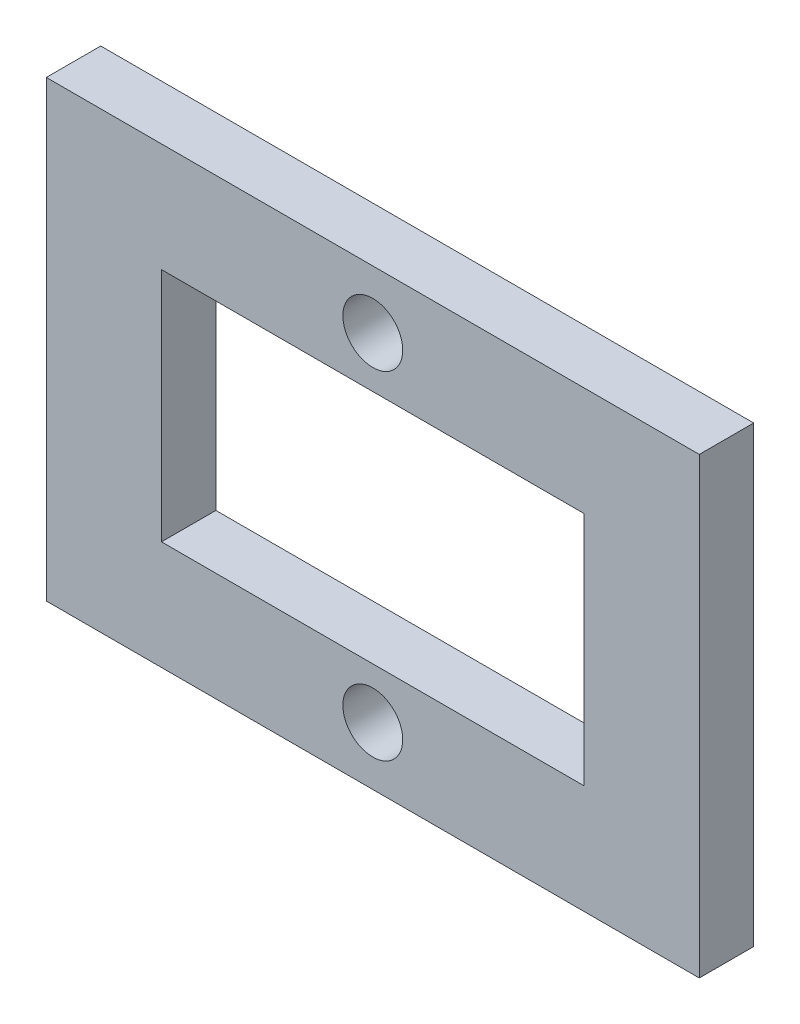
ISO-10303-21;
HEADER;
FILE_DESCRIPTION(('STEP AP214'),'2;1');
FILE_NAME('part.step','',(''),(''),'','','');
FILE_SCHEMA(('AUTOMOTIVE_DESIGN { 1 0 10303 214 1 1 1 1 }'));
ENDSEC;
DATA;
#1=APPLICATION_CONTEXT('core data for automotive mechanical design processes');
#2=APPLICATION_PROTOCOL_DEFINITION('international standard','automotive_design',2000,#1);
#3=PRODUCT_CONTEXT('',#1,'mechanical');
#4=PRODUCT('Part','Part','',(#3));
#5=PRODUCT_RELATED_PRODUCT_CATEGORY('part','',(#4));
#6=PRODUCT_DEFINITION_FORMATION('','',#4);
#7=PRODUCT_DEFINITION_CONTEXT('part definition',#1,'design');
#8=PRODUCT_DEFINITION('design','',#6,#7);
#9=PRODUCT_DEFINITION_SHAPE('','',#8);
#10=(LENGTH_UNIT() NAMED_UNIT(*) SI_UNIT(.MILLI.,.METRE.));
#11=(NAMED_UNIT(*) PLANE_ANGLE_UNIT() SI_UNIT($,.RADIAN.));
#12=(NAMED_UNIT(*) SI_UNIT($,.STERADIAN.) SOLID_ANGLE_UNIT());
#13=UNCERTAINTY_MEASURE_WITH_UNIT(LENGTH_MEASURE(1.E-05),#10,'distance_accuracy_value','');
#14=(GEOMETRIC_REPRESENTATION_CONTEXT(3) GLOBAL_UNCERTAINTY_ASSIGNED_CONTEXT((#13)) GLOBAL_UNIT_ASSIGNED_CONTEXT((#10,
#11,#12)) REPRESENTATION_CONTEXT('',''));
#15=CARTESIAN_POINT('',(0.,0.,0.));
#16=DIRECTION('',(0.,0.,1.));
#17=DIRECTION('',(1.,0.,0.));
#18=AXIS2_PLACEMENT_3D('',#15,#16,#17);
#19=CARTESIAN_POINT('',(244.65,9.3,30.));
#20=DIRECTION('',(0.,0.,1.));
#21=DIRECTION('',(1.,0.,0.));
#22=AXIS2_PLACEMENT_3D('',#19,#20,#21);
#23=CYLINDRICAL_SURFACE('',#22,1.65);
#24=DIRECTION('',(0.,0.,1.));
#25=VECTOR('',#24,1.);
#26=CARTESIAN_POINT('',(246.3,9.3,30.));
#27=LINE('',#26,#25);
#28=CARTESIAN_POINT('',(246.3,9.3,30.3));
#29=VERTEX_POINT('',#28);
#30=CARTESIAN_POINT('',(246.3,9.3,33.3));
#31=VERTEX_POINT('',#30);
#32=EDGE_CURVE('E10',#29,#31,#27,.T.);
#33=ORIENTED_EDGE('',*,*,#32,.F.);
#34=CARTESIAN_POINT('',(244.65,9.3,30.3));
#35=DIRECTION('',(0.,0.,1.));
#36=DIRECTION('',(1.,0.,0.));
#37=AXIS2_PLACEMENT_3D('',#34,#35,#36);
#38=CIRCLE('',#37,1.65);
#39=EDGE_CURVE('E118',#29,#29,#38,.T.);
#40=ORIENTED_EDGE('',*,*,#39,.F.);
#41=ORIENTED_EDGE('',*,*,#32,.T.);
#42=CARTESIAN_POINT('',(244.65,9.3,33.3));
#43=DIRECTION('',(0.,0.,1.));
#44=DIRECTION('',(1.,0.,0.));
#45=AXIS2_PLACEMENT_3D('',#42,#43,#44);
#46=CIRCLE('',#45,1.65);
#47=EDGE_CURVE('E117',#31,#31,#46,.T.);
#48=ORIENTED_EDGE('',*,*,#47,.T.);
#49=EDGE_LOOP('',(#33,#40,#41,#48));
#50=FACE_BOUND('',#49,.T.);
#51=ADVANCED_FACE('F15',(#50),#23,.F.);
#52=CARTESIAN_POINT('',(233.,6.5,30.));
#53=DIRECTION('',(0.,1.,0.));
#54=DIRECTION('',(1.,0.,0.));
#55=AXIS2_PLACEMENT_3D('',#52,#53,#54);
#56=PLANE('',#55);
#57=DIRECTION('',(-1.,0.,0.));
#58=VECTOR('',#57,1.);
#59=CARTESIAN_POINT('',(229.825,6.5,33.3));
#60=LINE('',#59,#58);
#61=CARTESIAN_POINT('',(256.3,6.5,33.3));
#62=VERTEX_POINT('',#61);
#63=CARTESIAN_POINT('',(233.,6.5,33.3));
#64=VERTEX_POINT('',#63);
#65=EDGE_CURVE('E151',#62,#64,#60,.T.);
#66=ORIENTED_EDGE('',*,*,#65,.T.);
#67=DIRECTION('',(0.,0.,1.));
#68=VECTOR('',#67,1.);
#69=CARTESIAN_POINT('',(233.,6.5,30.));
#70=LINE('',#69,#68);
#71=CARTESIAN_POINT('',(233.,6.5,30.3));
#72=VERTEX_POINT('',#71);
#73=EDGE_CURVE('E24',#72,#64,#70,.T.);
#74=ORIENTED_EDGE('',*,*,#73,.F.);
#75=DIRECTION('',(-1.,0.,0.));
#76=VECTOR('',#75,1.);
#77=CARTESIAN_POINT('',(229.825,6.5,30.3));
#78=LINE('',#77,#76);
#79=CARTESIAN_POINT('',(256.3,6.5,30.3));
#80=VERTEX_POINT('',#79);
#81=EDGE_CURVE('E197',#80,#72,#78,.T.);
#82=ORIENTED_EDGE('',*,*,#81,.F.);
#83=DIRECTION('',(0.,0.,1.));
#84=VECTOR('',#83,1.);
#85=CARTESIAN_POINT('',(256.3,6.5,30.));
#86=LINE('',#85,#84);
#87=EDGE_CURVE('E137',#80,#62,#86,.T.);
#88=ORIENTED_EDGE('',*,*,#87,.T.);
#89=EDGE_LOOP('',(#66,#74,#82,#88));
#90=FACE_BOUND('',#89,.T.);
#91=ADVANCED_FACE('F17',(#90),#56,.F.);
#92=CARTESIAN_POINT('',(233.,-6.5,30.));
#93=DIRECTION('',(1.,0.,0.));
#94=DIRECTION('',(0.,1.,0.));
#95=AXIS2_PLACEMENT_3D('',#92,#93,#94);
#96=PLANE('',#95);
#97=DIRECTION('',(0.,0.,1.));
#98=VECTOR('',#97,1.);
#99=CARTESIAN_POINT('',(233.,-6.5,30.));
#100=LINE('',#99,#98);
#101=CARTESIAN_POINT('',(233.,-6.5,30.3));
#102=VERTEX_POINT('',#101);
#103=CARTESIAN_POINT('',(233.,-6.5,33.3));
#104=VERTEX_POINT('',#103);
#105=EDGE_CURVE('E44',#102,#104,#100,.T.);
#106=ORIENTED_EDGE('',*,*,#105,.F.);
#107=DIRECTION('',(0.,1.,0.));
#108=VECTOR('',#107,1.);
#109=CARTESIAN_POINT('',(233.,-9.5,30.3));
#110=LINE('',#109,#108);
#111=EDGE_CURVE('E129',#102,#72,#110,.T.);
#112=ORIENTED_EDGE('',*,*,#111,.T.);
#113=ORIENTED_EDGE('',*,*,#73,.T.);
#114=DIRECTION('',(0.,1.,0.));
#115=VECTOR('',#114,1.);
#116=CARTESIAN_POINT('',(233.,-9.5,33.3));
#117=LINE('',#116,#115);
#118=EDGE_CURVE('E144',#104,#64,#117,.T.);
#119=ORIENTED_EDGE('',*,*,#118,.F.);
#120=EDGE_LOOP('',(#106,#112,#113,#119));
#121=FACE_BOUND('',#120,.T.);
#122=ADVANCED_FACE('F142',(#121),#96,.T.);
#123=CARTESIAN_POINT('',(256.3,-6.5,30.));
#124=DIRECTION('',(1.,0.,0.));
#125=DIRECTION('',(0.,1.,0.));
#126=AXIS2_PLACEMENT_3D('',#123,#124,#125);
#127=PLANE('',#126);
#128=DIRECTION('',(0.,1.,0.));
#129=VECTOR('',#128,1.);
#130=CARTESIAN_POINT('',(256.3,-9.5,33.3));
#131=LINE('',#130,#129);
#132=CARTESIAN_POINT('',(256.3,-6.5,33.3));
#133=VERTEX_POINT('',#132);
#134=EDGE_CURVE('E156',#133,#62,#131,.T.);
#135=ORIENTED_EDGE('',*,*,#134,.T.);
#136=ORIENTED_EDGE('',*,*,#87,.F.);
#137=DIRECTION('',(0.,1.,0.));
#138=VECTOR('',#137,1.);
#139=CARTESIAN_POINT('',(256.3,-9.5,30.3));
#140=LINE('',#139,#138);
#141=CARTESIAN_POINT('',(256.3,-6.5,30.3));
#142=VERTEX_POINT('',#141);
#143=EDGE_CURVE('E193',#142,#80,#140,.T.);
#144=ORIENTED_EDGE('',*,*,#143,.F.);
#145=DIRECTION('',(0.,0.,1.));
#146=VECTOR('',#145,1.);
#147=CARTESIAN_POINT('',(256.3,-6.5,30.));
#148=LINE('',#147,#146);
#149=EDGE_CURVE('E127',#142,#133,#148,.T.);
#150=ORIENTED_EDGE('',*,*,#149,.T.);
#151=EDGE_LOOP('',(#135,#136,#144,#150));
#152=FACE_BOUND('',#151,.T.);
#153=ADVANCED_FACE('F219',(#152),#127,.F.);
#154=CARTESIAN_POINT('',(233.,-6.5,30.));
#155=DIRECTION('',(0.,1.,0.));
#156=DIRECTION('',(1.,0.,0.));
#157=AXIS2_PLACEMENT_3D('',#154,#155,#156);
#158=PLANE('',#157);
#159=ORIENTED_EDGE('',*,*,#149,.F.);
#160=DIRECTION('',(-1.,0.,0.));
#161=VECTOR('',#160,1.);
#162=CARTESIAN_POINT('',(229.825,-6.5,30.3));
#163=LINE('',#162,#161);
#164=EDGE_CURVE('E122',#142,#102,#163,.T.);
#165=ORIENTED_EDGE('',*,*,#164,.T.);
#166=ORIENTED_EDGE('',*,*,#105,.T.);
#167=DIRECTION('',(-1.,0.,0.));
#168=VECTOR('',#167,1.);
#169=CARTESIAN_POINT('',(229.825,-6.5,33.3));
#170=LINE('',#169,#168);
#171=EDGE_CURVE('E161',#133,#104,#170,.T.);
#172=ORIENTED_EDGE('',*,*,#171,.F.);
#173=EDGE_LOOP('',(#159,#165,#166,#172));
#174=FACE_BOUND('',#173,.T.);
#175=ADVANCED_FACE('F292',(#174),#158,.T.);
#176=CARTESIAN_POINT('',(244.65,-9.3,30.));
#177=DIRECTION('',(0.,0.,1.));
#178=DIRECTION('',(1.,0.,0.));
#179=AXIS2_PLACEMENT_3D('',#176,#177,#178);
#180=CYLINDRICAL_SURFACE('',#179,1.65);
#181=DIRECTION('',(0.,0.,1.));
#182=VECTOR('',#181,1.);
#183=CARTESIAN_POINT('',(246.3,-9.3,30.));
#184=LINE('',#183,#182);
#185=CARTESIAN_POINT('',(246.3,-9.3,30.3));
#186=VERTEX_POINT('',#185);
#187=CARTESIAN_POINT('',(246.3,-9.3,33.3));
#188=VERTEX_POINT('',#187);
#189=EDGE_CURVE('E121',#186,#188,#184,.T.);
#190=ORIENTED_EDGE('',*,*,#189,.F.);
#191=CARTESIAN_POINT('',(244.65,-9.3,30.3));
#192=DIRECTION('',(0.,0.,1.));
#193=DIRECTION('',(1.,0.,0.));
#194=AXIS2_PLACEMENT_3D('',#191,#192,#193);
#195=CIRCLE('',#194,1.65);
#196=EDGE_CURVE('E189',#186,#186,#195,.T.);
#197=ORIENTED_EDGE('',*,*,#196,.F.);
#198=ORIENTED_EDGE('',*,*,#189,.T.);
#199=CARTESIAN_POINT('',(244.65,-9.3,33.3));
#200=DIRECTION('',(0.,0.,1.));
#201=DIRECTION('',(1.,0.,0.));
#202=AXIS2_PLACEMENT_3D('',#199,#200,#201);
#203=CIRCLE('',#202,1.65);
#204=EDGE_CURVE('E168',#188,#188,#203,.T.);
#205=ORIENTED_EDGE('',*,*,#204,.T.);
#206=EDGE_LOOP('',(#190,#197,#198,#205));
#207=FACE_BOUND('',#206,.T.);
#208=ADVANCED_FACE('F282',(#207),#180,.F.);
#209=CARTESIAN_POINT('',(262.65,-12.5,30.3));
#210=DIRECTION('',(1.,0.,0.));
#211=DIRECTION('',(0.,1.,0.));
#212=AXIS2_PLACEMENT_3D('',#209,#210,#211);
#213=PLANE('',#212);
#214=DIRECTION('',(0.,0.,1.));
#215=VECTOR('',#214,1.);
#216=CARTESIAN_POINT('',(262.65,-12.5,30.3));
#217=LINE('',#216,#215);
#218=CARTESIAN_POINT('',(262.65,-12.5,30.3));
#219=VERTEX_POINT('',#218);
#220=CARTESIAN_POINT('',(262.65,-12.5,33.3));
#221=VERTEX_POINT('',#220);
#222=EDGE_CURVE('E226',#219,#221,#217,.T.);
#223=ORIENTED_EDGE('',*,*,#222,.F.);
#224=DIRECTION('',(0.,1.,0.));
#225=VECTOR('',#224,1.);
#226=CARTESIAN_POINT('',(262.65,-12.5,30.3));
#227=LINE('',#226,#225);
#228=CARTESIAN_POINT('',(262.65,12.5,30.3));
#229=VERTEX_POINT('',#228);
#230=EDGE_CURVE('E186',#219,#229,#227,.T.);
#231=ORIENTED_EDGE('',*,*,#230,.T.);
#232=DIRECTION('',(0.,0.,1.));
#233=VECTOR('',#232,1.);
#234=CARTESIAN_POINT('',(262.65,12.5,30.3));
#235=LINE('',#234,#233);
#236=CARTESIAN_POINT('',(262.65,12.5,33.3));
#237=VERTEX_POINT('',#236);
#238=EDGE_CURVE('E183',#229,#237,#235,.T.);
#239=ORIENTED_EDGE('',*,*,#238,.T.);
#240=DIRECTION('',(0.,1.,0.));
#241=VECTOR('',#240,1.);
#242=CARTESIAN_POINT('',(262.65,-12.5,33.3));
#243=LINE('',#242,#241);
#244=EDGE_CURVE('E172',#221,#237,#243,.T.);
#245=ORIENTED_EDGE('',*,*,#244,.F.);
#246=EDGE_LOOP('',(#223,#231,#239,#245));
#247=FACE_BOUND('',#246,.T.);
#248=ADVANCED_FACE('F272',(#247),#213,.T.);
#249=CARTESIAN_POINT('',(226.65,-12.5,30.3));
#250=DIRECTION('',(0.,0.,1.));
#251=DIRECTION('',(1.,0.,0.));
#252=AXIS2_PLACEMENT_3D('',#249,#250,#251);
#253=PLANE('',#252);
#254=ORIENTED_EDGE('',*,*,#39,.T.);
#255=EDGE_LOOP('',(#254));
#256=FACE_BOUND('',#255,.T.);
#257=ORIENTED_EDGE('',*,*,#143,.T.);
#258=ORIENTED_EDGE('',*,*,#81,.T.);
#259=ORIENTED_EDGE('',*,*,#111,.F.);
#260=ORIENTED_EDGE('',*,*,#164,.F.);
#261=EDGE_LOOP('',(#257,#258,#259,#260));
#262=FACE_BOUND('',#261,.T.);
#263=ORIENTED_EDGE('',*,*,#196,.T.);
#264=EDGE_LOOP('',(#263));
#265=FACE_BOUND('',#264,.T.);
#266=DIRECTION('',(1.,0.,0.));
#267=VECTOR('',#266,1.);
#268=CARTESIAN_POINT('',(226.65,12.5,30.3));
#269=LINE('',#268,#267);
#270=CARTESIAN_POINT('',(226.65,12.5,30.3));
#271=VERTEX_POINT('',#270);
#272=EDGE_CURVE('E179',#271,#229,#269,.T.);
#273=ORIENTED_EDGE('',*,*,#272,.T.);
#274=ORIENTED_EDGE('',*,*,#230,.F.);
#275=DIRECTION('',(1.,0.,0.));
#276=VECTOR('',#275,1.);
#277=CARTESIAN_POINT('',(226.65,-12.5,30.3));
#278=LINE('',#277,#276);
#279=CARTESIAN_POINT('',(226.65,-12.5,30.3));
#280=VERTEX_POINT('',#279);
#281=EDGE_CURVE('E232',#280,#219,#278,.T.);
#282=ORIENTED_EDGE('',*,*,#281,.F.);
#283=DIRECTION('',(0.,1.,0.));
#284=VECTOR('',#283,1.);
#285=CARTESIAN_POINT('',(226.65,-12.5,30.3));
#286=LINE('',#285,#284);
#287=EDGE_CURVE('E250',#280,#271,#286,.T.);
#288=ORIENTED_EDGE('',*,*,#287,.T.);
#289=EDGE_LOOP('',(#273,#274,#282,#288));
#290=FACE_BOUND('',#289,.T.);
#291=ADVANCED_FACE('F214',(#256,#262,#265,#290),#253,.F.);
#292=CARTESIAN_POINT('',(226.65,12.5,30.3));
#293=DIRECTION('',(0.,1.,0.));
#294=DIRECTION('',(1.,0.,0.));
#295=AXIS2_PLACEMENT_3D('',#292,#293,#294);
#296=PLANE('',#295);
#297=ORIENTED_EDGE('',*,*,#272,.F.);
#298=DIRECTION('',(0.,0.,1.));
#299=VECTOR('',#298,1.);
#300=CARTESIAN_POINT('',(226.65,12.5,30.3));
#301=LINE('',#300,#299);
#302=CARTESIAN_POINT('',(226.65,12.5,33.3));
#303=VERTEX_POINT('',#302);
#304=EDGE_CURVE('E248',#271,#303,#301,.T.);
#305=ORIENTED_EDGE('',*,*,#304,.T.);
#306=DIRECTION('',(1.,0.,0.));
#307=VECTOR('',#306,1.);
#308=CARTESIAN_POINT('',(226.65,12.5,33.3));
#309=LINE('',#308,#307);
#310=EDGE_CURVE('E175',#303,#237,#309,.T.);
#311=ORIENTED_EDGE('',*,*,#310,.T.);
#312=ORIENTED_EDGE('',*,*,#238,.F.);
#313=EDGE_LOOP('',(#297,#305,#311,#312));
#314=FACE_BOUND('',#313,.T.);
#315=ADVANCED_FACE('F270',(#314),#296,.T.);
#316=CARTESIAN_POINT('',(226.65,-12.5,33.3));
#317=DIRECTION('',(0.,0.,1.));
#318=DIRECTION('',(1.,0.,0.));
#319=AXIS2_PLACEMENT_3D('',#316,#317,#318);
#320=PLANE('',#319);
#321=ORIENTED_EDGE('',*,*,#47,.F.);
#322=EDGE_LOOP('',(#321));
#323=FACE_BOUND('',#322,.T.);
#324=ORIENTED_EDGE('',*,*,#171,.T.);
#325=ORIENTED_EDGE('',*,*,#118,.T.);
#326=ORIENTED_EDGE('',*,*,#65,.F.);
#327=ORIENTED_EDGE('',*,*,#134,.F.);
#328=EDGE_LOOP('',(#324,#325,#326,#327));
#329=FACE_BOUND('',#328,.T.);
#330=ORIENTED_EDGE('',*,*,#204,.F.);
#331=EDGE_LOOP('',(#330));
#332=FACE_BOUND('',#331,.T.);
#333=DIRECTION('',(0.,1.,0.));
#334=VECTOR('',#333,1.);
#335=CARTESIAN_POINT('',(226.65,-12.5,33.3));
#336=LINE('',#335,#334);
#337=CARTESIAN_POINT('',(226.65,-12.5,33.3));
#338=VERTEX_POINT('',#337);
#339=EDGE_CURVE('E260',#338,#303,#336,.T.);
#340=ORIENTED_EDGE('',*,*,#339,.F.);
#341=DIRECTION('',(1.,0.,0.));
#342=VECTOR('',#341,1.);
#343=CARTESIAN_POINT('',(226.65,-12.5,33.3));
#344=LINE('',#343,#342);
#345=EDGE_CURVE('E228',#338,#221,#344,.T.);
#346=ORIENTED_EDGE('',*,*,#345,.T.);
#347=ORIENTED_EDGE('',*,*,#244,.T.);
#348=ORIENTED_EDGE('',*,*,#310,.F.);
#349=EDGE_LOOP('',(#340,#346,#347,#348));
#350=FACE_BOUND('',#349,.T.);
#351=ADVANCED_FACE('F158',(#323,#329,#332,#350),#320,.T.);
#352=CARTESIAN_POINT('',(226.65,-12.5,30.3));
#353=DIRECTION('',(0.,1.,0.));
#354=DIRECTION('',(1.,0.,0.));
#355=AXIS2_PLACEMENT_3D('',#352,#353,#354);
#356=PLANE('',#355);
#357=ORIENTED_EDGE('',*,*,#222,.T.);
#358=ORIENTED_EDGE('',*,*,#345,.F.);
#359=DIRECTION('',(0.,0.,1.));
#360=VECTOR('',#359,1.);
#361=CARTESIAN_POINT('',(226.65,-12.5,30.3));
#362=LINE('',#361,#360);
#363=EDGE_CURVE('E229',#280,#338,#362,.T.);
#364=ORIENTED_EDGE('',*,*,#363,.F.);
#365=ORIENTED_EDGE('',*,*,#281,.T.);
#366=EDGE_LOOP('',(#357,#358,#364,#365));
#367=FACE_BOUND('',#366,.T.);
#368=ADVANCED_FACE('F363',(#367),#356,.F.);
#369=CARTESIAN_POINT('',(226.65,-12.5,30.3));
#370=DIRECTION('',(1.,0.,0.));
#371=DIRECTION('',(0.,1.,0.));
#372=AXIS2_PLACEMENT_3D('',#369,#370,#371);
#373=PLANE('',#372);
#374=ORIENTED_EDGE('',*,*,#339,.T.);
#375=ORIENTED_EDGE('',*,*,#304,.F.);
#376=ORIENTED_EDGE('',*,*,#287,.F.);
#377=ORIENTED_EDGE('',*,*,#363,.T.);
#378=EDGE_LOOP('',(#374,#375,#376,#377));
#379=FACE_BOUND('',#378,.T.);
#380=ADVANCED_FACE('F258',(#379),#373,.F.);
#381=CLOSED_SHELL('',(#51,#91,#122,#153,#175,#208,#248,#291,#315,#351,#368,#380));
#382=MANIFOLD_SOLID_BREP('B1',#381);
#383=ADVANCED_BREP_SHAPE_REPRESENTATION('',(#18,#382),#14);
#384=SHAPE_DEFINITION_REPRESENTATION(#9,#383);
ENDSEC;
END-ISO-10303-21;
